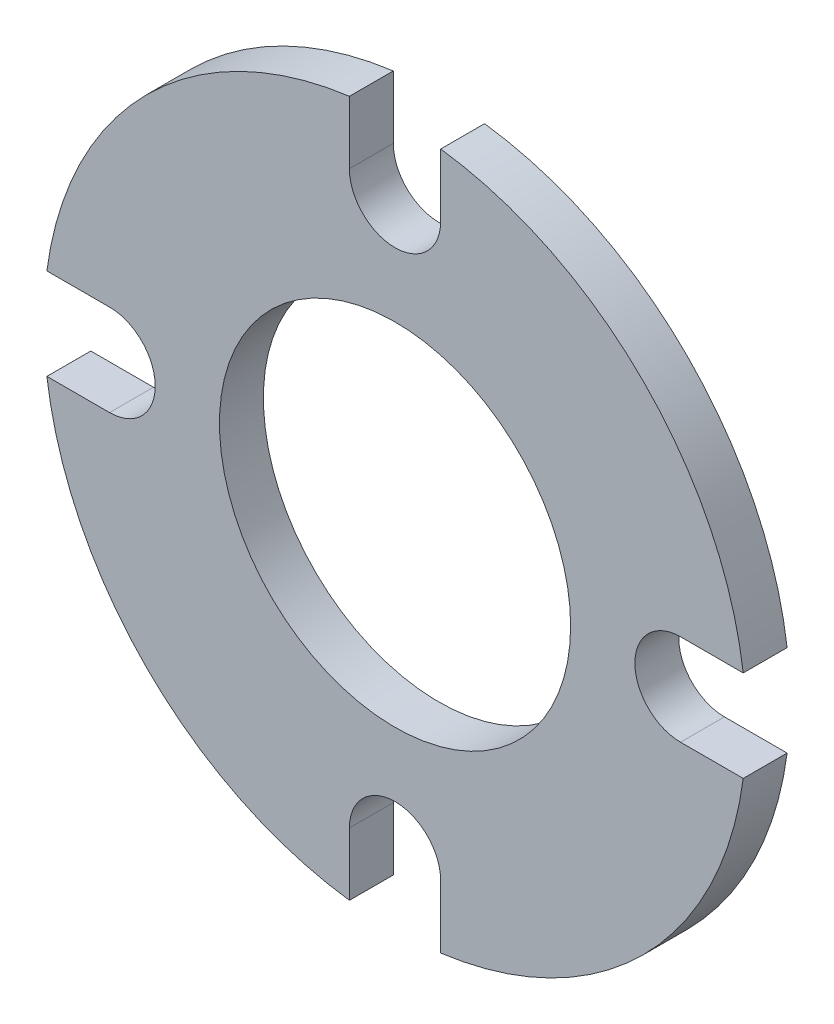
ISO-10303-21;
HEADER;
FILE_DESCRIPTION(('STEP AP214'),'2;1');
FILE_NAME('part.step','',(''),(''),'','','');
FILE_SCHEMA(('AUTOMOTIVE_DESIGN { 1 0 10303 214 1 1 1 1 }'));
ENDSEC;
DATA;
#1=APPLICATION_CONTEXT('core data for automotive mechanical design processes');
#2=APPLICATION_PROTOCOL_DEFINITION('international standard','automotive_design',2000,#1);
#3=PRODUCT_CONTEXT('',#1,'mechanical');
#4=PRODUCT('Part','Part','',(#3));
#5=PRODUCT_RELATED_PRODUCT_CATEGORY('part','',(#4));
#6=PRODUCT_DEFINITION_FORMATION('','',#4);
#7=PRODUCT_DEFINITION_CONTEXT('part definition',#1,'design');
#8=PRODUCT_DEFINITION('design','',#6,#7);
#9=PRODUCT_DEFINITION_SHAPE('','',#8);
#10=(LENGTH_UNIT() NAMED_UNIT(*) SI_UNIT(.MILLI.,.METRE.));
#11=(NAMED_UNIT(*) PLANE_ANGLE_UNIT() SI_UNIT($,.RADIAN.));
#12=(NAMED_UNIT(*) SI_UNIT($,.STERADIAN.) SOLID_ANGLE_UNIT());
#13=UNCERTAINTY_MEASURE_WITH_UNIT(LENGTH_MEASURE(1.E-05),#10,'distance_accuracy_value','');
#14=(GEOMETRIC_REPRESENTATION_CONTEXT(3) GLOBAL_UNCERTAINTY_ASSIGNED_CONTEXT((#13)) GLOBAL_UNIT_ASSIGNED_CONTEXT((#10,
#11,#12)) REPRESENTATION_CONTEXT('',''));
#15=CARTESIAN_POINT('',(0.,0.,0.));
#16=DIRECTION('',(0.,0.,1.));
#17=DIRECTION('',(1.,0.,0.));
#18=AXIS2_PLACEMENT_3D('',#15,#16,#17);
#19=CARTESIAN_POINT('',(0.,0.13,0.125));
#20=DIRECTION('',(0.,1.,0.));
#21=DIRECTION('',(-1.,0.,0.));
#22=AXIS2_PLACEMENT_3D('',#19,#20,#21);
#23=PLANE('',#22);
#24=DIRECTION('',(1.,0.,0.));
#25=VECTOR('',#24,1.);
#26=CARTESIAN_POINT('',(0.,0.13,0.));
#27=LINE('',#26,#25);
#28=CARTESIAN_POINT('',(0.813000000000001,0.129999999999997,0.));
#29=VERTEX_POINT('',#28);
#30=CARTESIAN_POINT('',(0.99151399384981,0.129999999999997,0.));
#31=VERTEX_POINT('',#30);
#32=EDGE_CURVE('E183',#29,#31,#27,.T.);
#33=ORIENTED_EDGE('',*,*,#32,.T.);
#34=DIRECTION('',(0.,0.,-1.));
#35=VECTOR('',#34,1.);
#36=CARTESIAN_POINT('',(0.99151399384981,0.129999999999997,0.125));
#37=LINE('',#36,#35);
#38=CARTESIAN_POINT('',(0.99151399384981,0.129999999999997,0.125));
#39=VERTEX_POINT('',#38);
#40=EDGE_CURVE('E11',#39,#31,#37,.T.);
#41=ORIENTED_EDGE('',*,*,#40,.F.);
#42=DIRECTION('',(1.,0.,0.));
#43=VECTOR('',#42,1.);
#44=CARTESIAN_POINT('',(0.,0.13,0.125));
#45=LINE('',#44,#43);
#46=CARTESIAN_POINT('',(0.813000000000001,0.129999999999997,0.125));
#47=VERTEX_POINT('',#46);
#48=EDGE_CURVE('E271',#47,#39,#45,.T.);
#49=ORIENTED_EDGE('',*,*,#48,.F.);
#50=DIRECTION('',(0.,0.,-1.));
#51=VECTOR('',#50,1.);
#52=CARTESIAN_POINT('',(0.813000000000001,0.129999999999997,0.125));
#53=LINE('',#52,#51);
#54=EDGE_CURVE('E50',#47,#29,#53,.T.);
#55=ORIENTED_EDGE('',*,*,#54,.T.);
#56=EDGE_LOOP('',(#33,#41,#49,#55));
#57=FACE_BOUND('',#56,.T.);
#58=ADVANCED_FACE('F33',(#57),#23,.F.);
#59=CARTESIAN_POINT('',(0.,0.,0.125));
#60=DIRECTION('',(0.,0.,-1.));
#61=DIRECTION('',(-1.,0.,0.));
#62=AXIS2_PLACEMENT_3D('',#59,#60,#61);
#63=CYLINDRICAL_SURFACE('',#62,1.);
#64=CARTESIAN_POINT('',(0.,0.,0.));
#65=DIRECTION('',(0.,0.,1.));
#66=DIRECTION('',(1.,0.,0.));
#67=AXIS2_PLACEMENT_3D('',#64,#65,#66);
#68=CIRCLE('',#67,1.);
#69=CARTESIAN_POINT('',(0.13,0.991513993849809,0.));
#70=VERTEX_POINT('',#69);
#71=EDGE_CURVE('E185',#31,#70,#68,.T.);
#72=ORIENTED_EDGE('',*,*,#71,.T.);
#73=DIRECTION('',(0.,0.,-1.));
#74=VECTOR('',#73,1.);
#75=CARTESIAN_POINT('',(0.13,0.991513993849809,0.125));
#76=LINE('',#75,#74);
#77=CARTESIAN_POINT('',(0.13,0.991513993849809,0.125));
#78=VERTEX_POINT('',#77);
#79=EDGE_CURVE('E42',#78,#70,#76,.T.);
#80=ORIENTED_EDGE('',*,*,#79,.F.);
#81=CARTESIAN_POINT('',(0.,0.,0.125));
#82=DIRECTION('',(0.,0.,1.));
#83=DIRECTION('',(1.,0.,0.));
#84=AXIS2_PLACEMENT_3D('',#81,#82,#83);
#85=CIRCLE('',#84,1.);
#86=EDGE_CURVE('E112',#39,#78,#85,.T.);
#87=ORIENTED_EDGE('',*,*,#86,.F.);
#88=ORIENTED_EDGE('',*,*,#40,.T.);
#89=EDGE_LOOP('',(#72,#80,#87,#88));
#90=FACE_BOUND('',#89,.T.);
#91=ADVANCED_FACE('F255',(#90),#63,.T.);
#92=CARTESIAN_POINT('',(0.13,0.,0.125));
#93=DIRECTION('',(-1.,0.,0.));
#94=DIRECTION('',(0.,0.,1.));
#95=AXIS2_PLACEMENT_3D('',#92,#93,#94);
#96=PLANE('',#95);
#97=DIRECTION('',(0.,1.,0.));
#98=VECTOR('',#97,1.);
#99=CARTESIAN_POINT('',(0.13,0.,0.));
#100=LINE('',#99,#98);
#101=CARTESIAN_POINT('',(0.13,0.813,0.));
#102=VERTEX_POINT('',#101);
#103=EDGE_CURVE('E188',#102,#70,#100,.T.);
#104=ORIENTED_EDGE('',*,*,#103,.F.);
#105=DIRECTION('',(0.,0.,-1.));
#106=VECTOR('',#105,1.);
#107=CARTESIAN_POINT('',(0.13,0.813,0.125));
#108=LINE('',#107,#106);
#109=CARTESIAN_POINT('',(0.13,0.813,0.125));
#110=VERTEX_POINT('',#109);
#111=EDGE_CURVE('E248',#110,#102,#108,.T.);
#112=ORIENTED_EDGE('',*,*,#111,.F.);
#113=DIRECTION('',(0.,1.,0.));
#114=VECTOR('',#113,1.);
#115=CARTESIAN_POINT('',(0.13,0.,0.125));
#116=LINE('',#115,#114);
#117=EDGE_CURVE('E254',#110,#78,#116,.T.);
#118=ORIENTED_EDGE('',*,*,#117,.T.);
#119=ORIENTED_EDGE('',*,*,#79,.T.);
#120=EDGE_LOOP('',(#104,#112,#118,#119));
#121=FACE_BOUND('',#120,.T.);
#122=ADVANCED_FACE('F252',(#121),#96,.T.);
#123=CARTESIAN_POINT('',(0.,0.813,0.125));
#124=DIRECTION('',(0.,0.,-1.));
#125=DIRECTION('',(-1.,0.,0.));
#126=AXIS2_PLACEMENT_3D('',#123,#124,#125);
#127=CYLINDRICAL_SURFACE('',#126,0.13);
#128=CARTESIAN_POINT('',(0.,0.813,0.));
#129=DIRECTION('',(0.,0.,1.));
#130=DIRECTION('',(1.,0.,0.));
#131=AXIS2_PLACEMENT_3D('',#128,#129,#130);
#132=CIRCLE('',#131,0.13);
#133=CARTESIAN_POINT('',(-0.13,0.813,0.));
#134=VERTEX_POINT('',#133);
#135=EDGE_CURVE('E191',#134,#102,#132,.T.);
#136=ORIENTED_EDGE('',*,*,#135,.F.);
#137=DIRECTION('',(0.,0.,-1.));
#138=VECTOR('',#137,1.);
#139=CARTESIAN_POINT('',(-0.13,0.813,0.125));
#140=LINE('',#139,#138);
#141=CARTESIAN_POINT('',(-0.13,0.813,0.125));
#142=VERTEX_POINT('',#141);
#143=EDGE_CURVE('E246',#142,#134,#140,.T.);
#144=ORIENTED_EDGE('',*,*,#143,.F.);
#145=CARTESIAN_POINT('',(0.,0.813,0.125));
#146=DIRECTION('',(0.,0.,1.));
#147=DIRECTION('',(1.,0.,0.));
#148=AXIS2_PLACEMENT_3D('',#145,#146,#147);
#149=CIRCLE('',#148,0.13);
#150=EDGE_CURVE('E267',#142,#110,#149,.T.);
#151=ORIENTED_EDGE('',*,*,#150,.T.);
#152=ORIENTED_EDGE('',*,*,#111,.T.);
#153=EDGE_LOOP('',(#136,#144,#151,#152));
#154=FACE_BOUND('',#153,.T.);
#155=ADVANCED_FACE('F263',(#154),#127,.F.);
#156=CARTESIAN_POINT('',(-0.13,0.,0.125));
#157=DIRECTION('',(-1.,0.,0.));
#158=DIRECTION('',(0.,0.,1.));
#159=AXIS2_PLACEMENT_3D('',#156,#157,#158);
#160=PLANE('',#159);
#161=DIRECTION('',(0.,1.,0.));
#162=VECTOR('',#161,1.);
#163=CARTESIAN_POINT('',(-0.13,0.,0.));
#164=LINE('',#163,#162);
#165=CARTESIAN_POINT('',(-0.13,0.991513993849809,0.));
#166=VERTEX_POINT('',#165);
#167=EDGE_CURVE('E194',#134,#166,#164,.T.);
#168=ORIENTED_EDGE('',*,*,#167,.T.);
#169=DIRECTION('',(0.,0.,-1.));
#170=VECTOR('',#169,1.);
#171=CARTESIAN_POINT('',(-0.13,0.991513993849809,0.125));
#172=LINE('',#171,#170);
#173=CARTESIAN_POINT('',(-0.13,0.991513993849809,0.125));
#174=VERTEX_POINT('',#173);
#175=EDGE_CURVE('E243',#174,#166,#172,.T.);
#176=ORIENTED_EDGE('',*,*,#175,.F.);
#177=DIRECTION('',(0.,1.,0.));
#178=VECTOR('',#177,1.);
#179=CARTESIAN_POINT('',(-0.13,0.,0.125));
#180=LINE('',#179,#178);
#181=EDGE_CURVE('E269',#142,#174,#180,.T.);
#182=ORIENTED_EDGE('',*,*,#181,.F.);
#183=ORIENTED_EDGE('',*,*,#143,.T.);
#184=EDGE_LOOP('',(#168,#176,#182,#183));
#185=FACE_BOUND('',#184,.T.);
#186=ADVANCED_FACE('F324',(#185),#160,.F.);
#187=CARTESIAN_POINT('',(0.,0.,0.125));
#188=DIRECTION('',(0.,0.,-1.));
#189=DIRECTION('',(-1.,0.,0.));
#190=AXIS2_PLACEMENT_3D('',#187,#188,#189);
#191=CYLINDRICAL_SURFACE('',#190,1.);
#192=CARTESIAN_POINT('',(0.,0.,0.));
#193=DIRECTION('',(0.,0.,1.));
#194=DIRECTION('',(1.,0.,0.));
#195=AXIS2_PLACEMENT_3D('',#192,#193,#194);
#196=CIRCLE('',#195,1.);
#197=CARTESIAN_POINT('',(-0.991513993849808,0.13000000000001,0.));
#198=VERTEX_POINT('',#197);
#199=EDGE_CURVE('E196',#166,#198,#196,.T.);
#200=ORIENTED_EDGE('',*,*,#199,.T.);
#201=DIRECTION('',(0.,0.,-1.));
#202=VECTOR('',#201,1.);
#203=CARTESIAN_POINT('',(-0.991513993849808,0.13000000000001,0.125));
#204=LINE('',#203,#202);
#205=CARTESIAN_POINT('',(-0.991513993849808,0.13000000000001,0.125));
#206=VERTEX_POINT('',#205);
#207=EDGE_CURVE('E241',#206,#198,#204,.T.);
#208=ORIENTED_EDGE('',*,*,#207,.F.);
#209=CARTESIAN_POINT('',(0.,0.,0.125));
#210=DIRECTION('',(0.,0.,1.));
#211=DIRECTION('',(1.,0.,0.));
#212=AXIS2_PLACEMENT_3D('',#209,#210,#211);
#213=CIRCLE('',#212,1.);
#214=EDGE_CURVE('E276',#174,#206,#213,.T.);
#215=ORIENTED_EDGE('',*,*,#214,.F.);
#216=ORIENTED_EDGE('',*,*,#175,.T.);
#217=EDGE_LOOP('',(#200,#208,#215,#216));
#218=FACE_BOUND('',#217,.T.);
#219=ADVANCED_FACE('F327',(#218),#191,.T.);
#220=CARTESIAN_POINT('',(0.,0.13,0.125));
#221=DIRECTION('',(0.,-1.,0.));
#222=DIRECTION('',(1.,0.,0.));
#223=AXIS2_PLACEMENT_3D('',#220,#221,#222);
#224=PLANE('',#223);
#225=DIRECTION('',(-1.,0.,0.));
#226=VECTOR('',#225,1.);
#227=CARTESIAN_POINT('',(0.,0.13,0.));
#228=LINE('',#227,#226);
#229=CARTESIAN_POINT('',(-0.812999999999999,0.130000000000009,0.));
#230=VERTEX_POINT('',#229);
#231=EDGE_CURVE('E199',#230,#198,#228,.T.);
#232=ORIENTED_EDGE('',*,*,#231,.F.);
#233=DIRECTION('',(0.,0.,-1.));
#234=VECTOR('',#233,1.);
#235=CARTESIAN_POINT('',(-0.812999999999999,0.130000000000009,0.125));
#236=LINE('',#235,#234);
#237=CARTESIAN_POINT('',(-0.812999999999999,0.130000000000009,0.125));
#238=VERTEX_POINT('',#237);
#239=EDGE_CURVE('E239',#238,#230,#236,.T.);
#240=ORIENTED_EDGE('',*,*,#239,.F.);
#241=DIRECTION('',(-1.,0.,0.));
#242=VECTOR('',#241,1.);
#243=CARTESIAN_POINT('',(0.,0.13,0.125));
#244=LINE('',#243,#242);
#245=EDGE_CURVE('E278',#238,#206,#244,.T.);
#246=ORIENTED_EDGE('',*,*,#245,.T.);
#247=ORIENTED_EDGE('',*,*,#207,.T.);
#248=EDGE_LOOP('',(#232,#240,#246,#247));
#249=FACE_BOUND('',#248,.T.);
#250=ADVANCED_FACE('F331',(#249),#224,.T.);
#251=CARTESIAN_POINT('',(-0.813,0.,0.125));
#252=DIRECTION('',(0.,0.,-1.));
#253=DIRECTION('',(-1.,0.,0.));
#254=AXIS2_PLACEMENT_3D('',#251,#252,#253);
#255=CYLINDRICAL_SURFACE('',#254,0.13);
#256=CARTESIAN_POINT('',(-0.813,0.,0.));
#257=DIRECTION('',(0.,0.,1.));
#258=DIRECTION('',(1.,0.,0.));
#259=AXIS2_PLACEMENT_3D('',#256,#257,#258);
#260=CIRCLE('',#259,0.13);
#261=CARTESIAN_POINT('',(-0.813000000000001,-0.129999999999992,0.));
#262=VERTEX_POINT('',#261);
#263=EDGE_CURVE('E202',#262,#230,#260,.T.);
#264=ORIENTED_EDGE('',*,*,#263,.F.);
#265=DIRECTION('',(0.,0.,-1.));
#266=VECTOR('',#265,1.);
#267=CARTESIAN_POINT('',(-0.813000000000001,-0.129999999999992,0.125));
#268=LINE('',#267,#266);
#269=CARTESIAN_POINT('',(-0.813000000000001,-0.129999999999992,0.125));
#270=VERTEX_POINT('',#269);
#271=EDGE_CURVE('E237',#270,#262,#268,.T.);
#272=ORIENTED_EDGE('',*,*,#271,.F.);
#273=CARTESIAN_POINT('',(-0.813,0.,0.125));
#274=DIRECTION('',(0.,0.,1.));
#275=DIRECTION('',(1.,0.,0.));
#276=AXIS2_PLACEMENT_3D('',#273,#274,#275);
#277=CIRCLE('',#276,0.13);
#278=EDGE_CURVE('E281',#270,#238,#277,.T.);
#279=ORIENTED_EDGE('',*,*,#278,.T.);
#280=ORIENTED_EDGE('',*,*,#239,.T.);
#281=EDGE_LOOP('',(#264,#272,#279,#280));
#282=FACE_BOUND('',#281,.T.);
#283=ADVANCED_FACE('F335',(#282),#255,.F.);
#284=CARTESIAN_POINT('',(0.,-0.13,0.125));
#285=DIRECTION('',(0.,-1.,0.));
#286=DIRECTION('',(1.,0.,0.));
#287=AXIS2_PLACEMENT_3D('',#284,#285,#286);
#288=PLANE('',#287);
#289=DIRECTION('',(-1.,0.,0.));
#290=VECTOR('',#289,1.);
#291=CARTESIAN_POINT('',(0.,-0.13,0.));
#292=LINE('',#291,#290);
#293=CARTESIAN_POINT('',(-0.991513993849811,-0.12999999999999,0.));
#294=VERTEX_POINT('',#293);
#295=EDGE_CURVE('E205',#262,#294,#292,.T.);
#296=ORIENTED_EDGE('',*,*,#295,.T.);
#297=DIRECTION('',(0.,0.,-1.));
#298=VECTOR('',#297,1.);
#299=CARTESIAN_POINT('',(-0.991513993849811,-0.12999999999999,0.125));
#300=LINE('',#299,#298);
#301=CARTESIAN_POINT('',(-0.991513993849811,-0.12999999999999,0.125));
#302=VERTEX_POINT('',#301);
#303=EDGE_CURVE('E234',#302,#294,#300,.T.);
#304=ORIENTED_EDGE('',*,*,#303,.F.);
#305=DIRECTION('',(-1.,0.,0.));
#306=VECTOR('',#305,1.);
#307=CARTESIAN_POINT('',(0.,-0.13,0.125));
#308=LINE('',#307,#306);
#309=EDGE_CURVE('E284',#270,#302,#308,.T.);
#310=ORIENTED_EDGE('',*,*,#309,.F.);
#311=ORIENTED_EDGE('',*,*,#271,.T.);
#312=EDGE_LOOP('',(#296,#304,#310,#311));
#313=FACE_BOUND('',#312,.T.);
#314=ADVANCED_FACE('F339',(#313),#288,.F.);
#315=CARTESIAN_POINT('',(0.,0.,0.125));
#316=DIRECTION('',(0.,0.,-1.));
#317=DIRECTION('',(-1.,0.,0.));
#318=AXIS2_PLACEMENT_3D('',#315,#316,#317);
#319=CYLINDRICAL_SURFACE('',#318,1.);
#320=CARTESIAN_POINT('',(0.,0.,0.));
#321=DIRECTION('',(0.,0.,1.));
#322=DIRECTION('',(1.,0.,0.));
#323=AXIS2_PLACEMENT_3D('',#320,#321,#322);
#324=CIRCLE('',#323,1.);
#325=CARTESIAN_POINT('',(-0.130000000000007,-0.991513993849809,0.));
#326=VERTEX_POINT('',#325);
#327=EDGE_CURVE('E207',#294,#326,#324,.T.);
#328=ORIENTED_EDGE('',*,*,#327,.T.);
#329=DIRECTION('',(0.,0.,-1.));
#330=VECTOR('',#329,1.);
#331=CARTESIAN_POINT('',(-0.130000000000007,-0.991513993849809,0.125));
#332=LINE('',#331,#330);
#333=CARTESIAN_POINT('',(-0.130000000000007,-0.991513993849809,0.125));
#334=VERTEX_POINT('',#333);
#335=EDGE_CURVE('E232',#334,#326,#332,.T.);
#336=ORIENTED_EDGE('',*,*,#335,.F.);
#337=CARTESIAN_POINT('',(0.,0.,0.125));
#338=DIRECTION('',(0.,0.,1.));
#339=DIRECTION('',(1.,0.,0.));
#340=AXIS2_PLACEMENT_3D('',#337,#338,#339);
#341=CIRCLE('',#340,1.);
#342=EDGE_CURVE('E286',#302,#334,#341,.T.);
#343=ORIENTED_EDGE('',*,*,#342,.F.);
#344=ORIENTED_EDGE('',*,*,#303,.T.);
#345=EDGE_LOOP('',(#328,#336,#343,#344));
#346=FACE_BOUND('',#345,.T.);
#347=ADVANCED_FACE('F343',(#346),#319,.T.);
#348=CARTESIAN_POINT('',(-0.13,0.,0.125));
#349=DIRECTION('',(1.,0.,0.));
#350=DIRECTION('',(0.,1.,0.));
#351=AXIS2_PLACEMENT_3D('',#348,#349,#350);
#352=PLANE('',#351);
#353=DIRECTION('',(0.,-1.,0.));
#354=VECTOR('',#353,1.);
#355=CARTESIAN_POINT('',(-0.13,0.,0.));
#356=LINE('',#355,#354);
#357=CARTESIAN_POINT('',(-0.130000000000006,-0.812999999999999,0.));
#358=VERTEX_POINT('',#357);
#359=EDGE_CURVE('E210',#358,#326,#356,.T.);
#360=ORIENTED_EDGE('',*,*,#359,.F.);
#361=DIRECTION('',(0.,0.,-1.));
#362=VECTOR('',#361,1.);
#363=CARTESIAN_POINT('',(-0.130000000000006,-0.812999999999999,0.125));
#364=LINE('',#363,#362);
#365=CARTESIAN_POINT('',(-0.130000000000006,-0.812999999999999,0.125));
#366=VERTEX_POINT('',#365);
#367=EDGE_CURVE('E230',#366,#358,#364,.T.);
#368=ORIENTED_EDGE('',*,*,#367,.F.);
#369=DIRECTION('',(0.,-1.,0.));
#370=VECTOR('',#369,1.);
#371=CARTESIAN_POINT('',(-0.13,0.,0.125));
#372=LINE('',#371,#370);
#373=EDGE_CURVE('E288',#366,#334,#372,.T.);
#374=ORIENTED_EDGE('',*,*,#373,.T.);
#375=ORIENTED_EDGE('',*,*,#335,.T.);
#376=EDGE_LOOP('',(#360,#368,#374,#375));
#377=FACE_BOUND('',#376,.T.);
#378=ADVANCED_FACE('F301',(#377),#352,.T.);
#379=CARTESIAN_POINT('',(0.,-0.813,0.125));
#380=DIRECTION('',(0.,0.,-1.));
#381=DIRECTION('',(-1.,0.,0.));
#382=AXIS2_PLACEMENT_3D('',#379,#380,#381);
#383=CYLINDRICAL_SURFACE('',#382,0.13);
#384=CARTESIAN_POINT('',(0.,-0.813,0.));
#385=DIRECTION('',(0.,0.,1.));
#386=DIRECTION('',(1.,0.,0.));
#387=AXIS2_PLACEMENT_3D('',#384,#385,#386);
#388=CIRCLE('',#387,0.13);
#389=CARTESIAN_POINT('',(0.129999999999994,-0.813000000000001,0.));
#390=VERTEX_POINT('',#389);
#391=EDGE_CURVE('E213',#390,#358,#388,.T.);
#392=ORIENTED_EDGE('',*,*,#391,.F.);
#393=DIRECTION('',(0.,0.,-1.));
#394=VECTOR('',#393,1.);
#395=CARTESIAN_POINT('',(0.129999999999994,-0.813000000000001,0.125));
#396=LINE('',#395,#394);
#397=CARTESIAN_POINT('',(0.129999999999994,-0.813000000000001,0.125));
#398=VERTEX_POINT('',#397);
#399=EDGE_CURVE('E228',#398,#390,#396,.T.);
#400=ORIENTED_EDGE('',*,*,#399,.F.);
#401=CARTESIAN_POINT('',(0.,-0.813,0.125));
#402=DIRECTION('',(0.,0.,1.));
#403=DIRECTION('',(1.,0.,0.));
#404=AXIS2_PLACEMENT_3D('',#401,#402,#403);
#405=CIRCLE('',#404,0.13);
#406=EDGE_CURVE('E291',#398,#366,#405,.T.);
#407=ORIENTED_EDGE('',*,*,#406,.T.);
#408=ORIENTED_EDGE('',*,*,#367,.T.);
#409=EDGE_LOOP('',(#392,#400,#407,#408));
#410=FACE_BOUND('',#409,.T.);
#411=ADVANCED_FACE('F295',(#410),#383,.F.);
#412=CARTESIAN_POINT('',(0.13,0.,0.125));
#413=DIRECTION('',(1.,0.,0.));
#414=DIRECTION('',(0.,1.,0.));
#415=AXIS2_PLACEMENT_3D('',#412,#413,#414);
#416=PLANE('',#415);
#417=DIRECTION('',(0.,-1.,0.));
#418=VECTOR('',#417,1.);
#419=CARTESIAN_POINT('',(0.13,0.,0.));
#420=LINE('',#419,#418);
#421=CARTESIAN_POINT('',(0.129999999999993,-0.99151399384981,0.));
#422=VERTEX_POINT('',#421);
#423=EDGE_CURVE('E216',#390,#422,#420,.T.);
#424=ORIENTED_EDGE('',*,*,#423,.T.);
#425=DIRECTION('',(0.,0.,-1.));
#426=VECTOR('',#425,1.);
#427=CARTESIAN_POINT('',(0.129999999999993,-0.99151399384981,0.125));
#428=LINE('',#427,#426);
#429=CARTESIAN_POINT('',(0.129999999999993,-0.99151399384981,0.125));
#430=VERTEX_POINT('',#429);
#431=EDGE_CURVE('E172',#430,#422,#428,.T.);
#432=ORIENTED_EDGE('',*,*,#431,.F.);
#433=DIRECTION('',(0.,-1.,0.));
#434=VECTOR('',#433,1.);
#435=CARTESIAN_POINT('',(0.13,0.,0.125));
#436=LINE('',#435,#434);
#437=EDGE_CURVE('E160',#398,#430,#436,.T.);
#438=ORIENTED_EDGE('',*,*,#437,.F.);
#439=ORIENTED_EDGE('',*,*,#399,.T.);
#440=EDGE_LOOP('',(#424,#432,#438,#439));
#441=FACE_BOUND('',#440,.T.);
#442=ADVANCED_FACE('F305',(#441),#416,.F.);
#443=CARTESIAN_POINT('',(0.,0.,0.125));
#444=DIRECTION('',(0.,0.,-1.));
#445=DIRECTION('',(-1.,0.,0.));
#446=AXIS2_PLACEMENT_3D('',#443,#444,#445);
#447=CYLINDRICAL_SURFACE('',#446,1.);
#448=CARTESIAN_POINT('',(0.,0.,0.));
#449=DIRECTION('',(0.,0.,1.));
#450=DIRECTION('',(1.,0.,0.));
#451=AXIS2_PLACEMENT_3D('',#448,#449,#450);
#452=CIRCLE('',#451,1.);
#453=CARTESIAN_POINT('',(0.991513993849809,-0.130000000000003,0.));
#454=VERTEX_POINT('',#453);
#455=EDGE_CURVE('E169',#422,#454,#452,.T.);
#456=ORIENTED_EDGE('',*,*,#455,.T.);
#457=DIRECTION('',(0.,0.,-1.));
#458=VECTOR('',#457,1.);
#459=CARTESIAN_POINT('',(0.991513993849809,-0.130000000000003,0.125));
#460=LINE('',#459,#458);
#461=CARTESIAN_POINT('',(0.991513993849809,-0.130000000000003,0.125));
#462=VERTEX_POINT('',#461);
#463=EDGE_CURVE('E166',#462,#454,#460,.T.);
#464=ORIENTED_EDGE('',*,*,#463,.F.);
#465=CARTESIAN_POINT('',(0.,0.,0.125));
#466=DIRECTION('',(0.,0.,1.));
#467=DIRECTION('',(1.,0.,0.));
#468=AXIS2_PLACEMENT_3D('',#465,#466,#467);
#469=CIRCLE('',#468,1.);
#470=EDGE_CURVE('E152',#430,#462,#469,.T.);
#471=ORIENTED_EDGE('',*,*,#470,.F.);
#472=ORIENTED_EDGE('',*,*,#431,.T.);
#473=EDGE_LOOP('',(#456,#464,#471,#472));
#474=FACE_BOUND('',#473,.T.);
#475=ADVANCED_FACE('F167',(#474),#447,.T.);
#476=CARTESIAN_POINT('',(0.,-0.13,0.125));
#477=DIRECTION('',(0.,1.,0.));
#478=DIRECTION('',(-1.,0.,0.));
#479=AXIS2_PLACEMENT_3D('',#476,#477,#478);
#480=PLANE('',#479);
#481=DIRECTION('',(1.,0.,0.));
#482=VECTOR('',#481,1.);
#483=CARTESIAN_POINT('',(0.,-0.13,0.));
#484=LINE('',#483,#482);
#485=CARTESIAN_POINT('',(0.813,-0.130000000000003,0.));
#486=VERTEX_POINT('',#485);
#487=EDGE_CURVE('E219',#486,#454,#484,.T.);
#488=ORIENTED_EDGE('',*,*,#487,.F.);
#489=DIRECTION('',(0.,0.,-1.));
#490=VECTOR('',#489,1.);
#491=CARTESIAN_POINT('',(0.813,-0.130000000000003,0.125));
#492=LINE('',#491,#490);
#493=CARTESIAN_POINT('',(0.813,-0.130000000000003,0.125));
#494=VERTEX_POINT('',#493);
#495=EDGE_CURVE('E100',#494,#486,#492,.T.);
#496=ORIENTED_EDGE('',*,*,#495,.F.);
#497=DIRECTION('',(1.,0.,0.));
#498=VECTOR('',#497,1.);
#499=CARTESIAN_POINT('',(0.,-0.13,0.125));
#500=LINE('',#499,#498);
#501=EDGE_CURVE('E157',#494,#462,#500,.T.);
#502=ORIENTED_EDGE('',*,*,#501,.T.);
#503=ORIENTED_EDGE('',*,*,#463,.T.);
#504=EDGE_LOOP('',(#488,#496,#502,#503));
#505=FACE_BOUND('',#504,.T.);
#506=ADVANCED_FACE('F174',(#505),#480,.T.);
#507=CARTESIAN_POINT('',(0.,0.,0.125));
#508=DIRECTION('',(0.,0.,-1.));
#509=DIRECTION('',(-1.,0.,0.));
#510=AXIS2_PLACEMENT_3D('',#507,#508,#509);
#511=CYLINDRICAL_SURFACE('',#510,0.5);
#512=CARTESIAN_POINT('',(0.,0.,0.125));
#513=DIRECTION('',(0.,0.,1.));
#514=DIRECTION('',(1.,0.,0.));
#515=AXIS2_PLACEMENT_3D('',#512,#513,#514);
#516=CIRCLE('',#515,0.5);
#517=CARTESIAN_POINT('',(0.5,0.,0.125));
#518=VERTEX_POINT('',#517);
#519=EDGE_CURVE('E224',#518,#518,#516,.T.);
#520=ORIENTED_EDGE('',*,*,#519,.T.);
#521=EDGE_LOOP('',(#520));
#522=FACE_BOUND('',#521,.T.);
#523=CARTESIAN_POINT('',(0.,0.,0.));
#524=DIRECTION('',(0.,0.,1.));
#525=DIRECTION('',(1.,0.,0.));
#526=AXIS2_PLACEMENT_3D('',#523,#524,#525);
#527=CIRCLE('',#526,0.5);
#528=CARTESIAN_POINT('',(0.5,0.,0.));
#529=VERTEX_POINT('',#528);
#530=EDGE_CURVE('E180',#529,#529,#527,.T.);
#531=ORIENTED_EDGE('',*,*,#530,.F.);
#532=EDGE_LOOP('',(#531));
#533=FACE_BOUND('',#532,.T.);
#534=ADVANCED_FACE('F35',(#522,#533),#511,.F.);
#535=CARTESIAN_POINT('',(0.813,0.,0.125));
#536=DIRECTION('',(0.,0.,-1.));
#537=DIRECTION('',(-1.,0.,0.));
#538=AXIS2_PLACEMENT_3D('',#535,#536,#537);
#539=CYLINDRICAL_SURFACE('',#538,0.13);
#540=CARTESIAN_POINT('',(0.813,0.,0.));
#541=DIRECTION('',(0.,0.,1.));
#542=DIRECTION('',(1.,0.,0.));
#543=AXIS2_PLACEMENT_3D('',#540,#541,#542);
#544=CIRCLE('',#543,0.13);
#545=EDGE_CURVE('E221',#29,#486,#544,.T.);
#546=ORIENTED_EDGE('',*,*,#545,.F.);
#547=ORIENTED_EDGE('',*,*,#54,.F.);
#548=CARTESIAN_POINT('',(0.813,0.,0.125));
#549=DIRECTION('',(0.,0.,1.));
#550=DIRECTION('',(1.,0.,0.));
#551=AXIS2_PLACEMENT_3D('',#548,#549,#550);
#552=CIRCLE('',#551,0.13);
#553=EDGE_CURVE('E175',#47,#494,#552,.T.);
#554=ORIENTED_EDGE('',*,*,#553,.T.);
#555=ORIENTED_EDGE('',*,*,#495,.T.);
#556=EDGE_LOOP('',(#546,#547,#554,#555));
#557=FACE_BOUND('',#556,.T.);
#558=ADVANCED_FACE('F385',(#557),#539,.F.);
#559=CARTESIAN_POINT('',(0.,0.,0.125));
#560=DIRECTION('',(0.,0.,1.));
#561=DIRECTION('',(1.,0.,0.));
#562=AXIS2_PLACEMENT_3D('',#559,#560,#561);
#563=PLANE('',#562);
#564=ORIENTED_EDGE('',*,*,#519,.F.);
#565=EDGE_LOOP('',(#564));
#566=FACE_BOUND('',#565,.T.);
#567=ORIENTED_EDGE('',*,*,#48,.T.);
#568=ORIENTED_EDGE('',*,*,#86,.T.);
#569=ORIENTED_EDGE('',*,*,#117,.F.);
#570=ORIENTED_EDGE('',*,*,#150,.F.);
#571=ORIENTED_EDGE('',*,*,#181,.T.);
#572=ORIENTED_EDGE('',*,*,#214,.T.);
#573=ORIENTED_EDGE('',*,*,#245,.F.);
#574=ORIENTED_EDGE('',*,*,#278,.F.);
#575=ORIENTED_EDGE('',*,*,#309,.T.);
#576=ORIENTED_EDGE('',*,*,#342,.T.);
#577=ORIENTED_EDGE('',*,*,#373,.F.);
#578=ORIENTED_EDGE('',*,*,#406,.F.);
#579=ORIENTED_EDGE('',*,*,#437,.T.);
#580=ORIENTED_EDGE('',*,*,#470,.T.);
#581=ORIENTED_EDGE('',*,*,#501,.F.);
#582=ORIENTED_EDGE('',*,*,#553,.F.);
#583=EDGE_LOOP('',(#567,#568,#569,#570,#571,#572,#573,#574,#575,#576,#577,#578,#579,#580,#581,#582));
#584=FACE_BOUND('',#583,.T.);
#585=ADVANCED_FACE('F154',(#566,#584),#563,.T.);
#586=CARTESIAN_POINT('',(0.,0.,0.));
#587=DIRECTION('',(0.,0.,1.));
#588=DIRECTION('',(1.,0.,0.));
#589=AXIS2_PLACEMENT_3D('',#586,#587,#588);
#590=PLANE('',#589);
#591=ORIENTED_EDGE('',*,*,#530,.T.);
#592=EDGE_LOOP('',(#591));
#593=FACE_BOUND('',#592,.T.);
#594=ORIENTED_EDGE('',*,*,#32,.F.);
#595=ORIENTED_EDGE('',*,*,#545,.T.);
#596=ORIENTED_EDGE('',*,*,#487,.T.);
#597=ORIENTED_EDGE('',*,*,#455,.F.);
#598=ORIENTED_EDGE('',*,*,#423,.F.);
#599=ORIENTED_EDGE('',*,*,#391,.T.);
#600=ORIENTED_EDGE('',*,*,#359,.T.);
#601=ORIENTED_EDGE('',*,*,#327,.F.);
#602=ORIENTED_EDGE('',*,*,#295,.F.);
#603=ORIENTED_EDGE('',*,*,#263,.T.);
#604=ORIENTED_EDGE('',*,*,#231,.T.);
#605=ORIENTED_EDGE('',*,*,#199,.F.);
#606=ORIENTED_EDGE('',*,*,#167,.F.);
#607=ORIENTED_EDGE('',*,*,#135,.T.);
#608=ORIENTED_EDGE('',*,*,#103,.T.);
#609=ORIENTED_EDGE('',*,*,#71,.F.);
#610=EDGE_LOOP('',(#594,#595,#596,#597,#598,#599,#600,#601,#602,#603,#604,#605,#606,#607,#608,#609));
#611=FACE_BOUND('',#610,.T.);
#612=ADVANCED_FACE('F258',(#593,#611),#590,.F.);
#613=CLOSED_SHELL('',(#58,#91,#122,#155,#186,#219,#250,#283,#314,#347,#378,#411,#442,#475,#506,
#534,#558,#585,#612));
#614=MANIFOLD_SOLID_BREP('B2',#613);
#615=ADVANCED_BREP_SHAPE_REPRESENTATION('',(#18,#614),#14);
#616=SHAPE_DEFINITION_REPRESENTATION(#9,#615);
ENDSEC;
END-ISO-10303-21;
